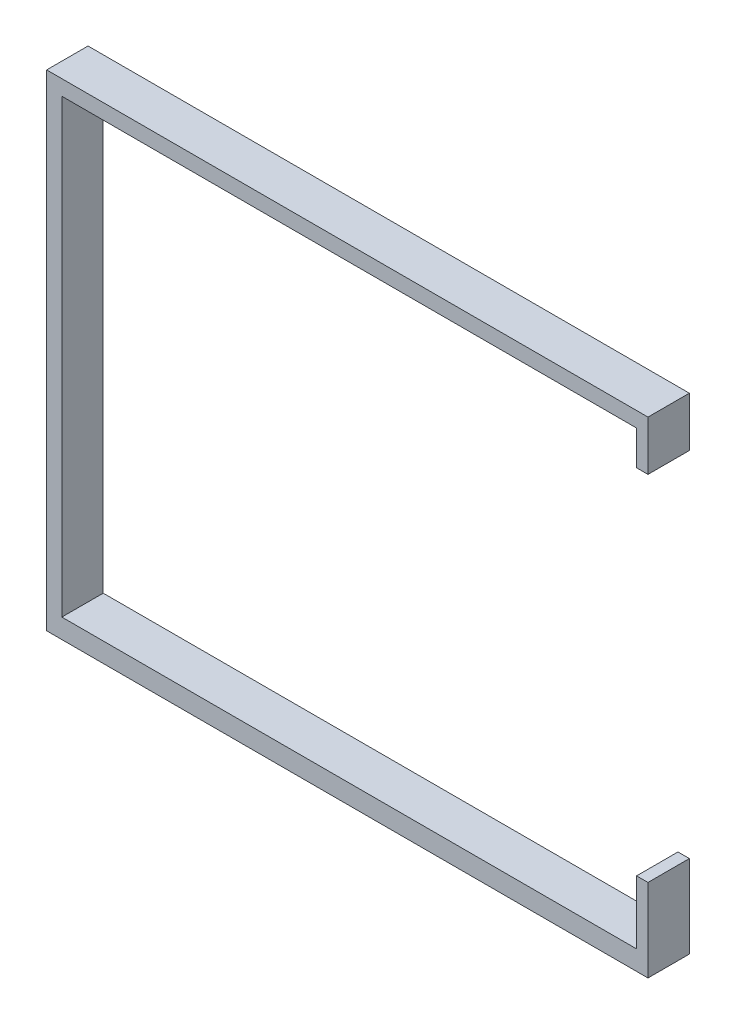
ISO-10303-21;
HEADER;
FILE_DESCRIPTION(('STEP AP214'),'2;1');
FILE_NAME('part.step','',(''),(''),'','','');
FILE_SCHEMA(('AUTOMOTIVE_DESIGN { 1 0 10303 214 1 1 1 1 }'));
ENDSEC;
DATA;
#1=APPLICATION_CONTEXT('core data for automotive mechanical design processes');
#2=APPLICATION_PROTOCOL_DEFINITION('international standard','automotive_design',2000,#1);
#3=PRODUCT_CONTEXT('',#1,'mechanical');
#4=PRODUCT('Part','Part','',(#3));
#5=PRODUCT_RELATED_PRODUCT_CATEGORY('part','',(#4));
#6=PRODUCT_DEFINITION_FORMATION('','',#4);
#7=PRODUCT_DEFINITION_CONTEXT('part definition',#1,'design');
#8=PRODUCT_DEFINITION('design','',#6,#7);
#9=PRODUCT_DEFINITION_SHAPE('','',#8);
#10=(LENGTH_UNIT() NAMED_UNIT(*) SI_UNIT(.MILLI.,.METRE.));
#11=(NAMED_UNIT(*) PLANE_ANGLE_UNIT() SI_UNIT($,.RADIAN.));
#12=(NAMED_UNIT(*) SI_UNIT($,.STERADIAN.) SOLID_ANGLE_UNIT());
#13=UNCERTAINTY_MEASURE_WITH_UNIT(LENGTH_MEASURE(1.E-05),#10,'distance_accuracy_value','');
#14=(GEOMETRIC_REPRESENTATION_CONTEXT(3) GLOBAL_UNCERTAINTY_ASSIGNED_CONTEXT((#13)) GLOBAL_UNIT_ASSIGNED_CONTEXT((#10,
#11,#12)) REPRESENTATION_CONTEXT('',''));
#15=CARTESIAN_POINT('',(0.,0.,0.));
#16=DIRECTION('',(0.,0.,1.));
#17=DIRECTION('',(1.,0.,0.));
#18=AXIS2_PLACEMENT_3D('',#15,#16,#17);
#19=CARTESIAN_POINT('',(35.7762962962963,25.9940740740741,5.));
#20=DIRECTION('',(-1.,0.,0.));
#21=DIRECTION('',(0.,0.,1.));
#22=AXIS2_PLACEMENT_3D('',#19,#20,#21);
#23=PLANE('',#22);
#24=DIRECTION('',(0.,1.,0.));
#25=VECTOR('',#24,1.);
#26=CARTESIAN_POINT('',(35.7762962962963,25.9940740740741,5.));
#27=LINE('',#26,#25);
#28=CARTESIAN_POINT('',(35.7762962962963,19.9940740740741,5.));
#29=VERTEX_POINT('',#28);
#30=CARTESIAN_POINT('',(35.7762962962963,25.9940740740741,5.));
#31=VERTEX_POINT('',#30);
#32=EDGE_CURVE('E236',#29,#31,#27,.T.);
#33=ORIENTED_EDGE('',*,*,#32,.F.);
#34=DIRECTION('',(0.,0.,1.));
#35=VECTOR('',#34,1.);
#36=CARTESIAN_POINT('',(35.7762962962963,19.9940740740741,5.));
#37=LINE('',#36,#35);
#38=CARTESIAN_POINT('',(35.7762962962963,19.9940740740741,0.));
#39=VERTEX_POINT('',#38);
#40=EDGE_CURVE('E196',#39,#29,#37,.T.);
#41=ORIENTED_EDGE('',*,*,#40,.F.);
#42=DIRECTION('',(0.,1.,0.));
#43=VECTOR('',#42,1.);
#44=CARTESIAN_POINT('',(35.7762962962963,25.9940740740741,0.));
#45=LINE('',#44,#43);
#46=CARTESIAN_POINT('',(35.7762962962963,25.9940740740741,0.));
#47=VERTEX_POINT('',#46);
#48=EDGE_CURVE('E158',#39,#47,#45,.T.);
#49=ORIENTED_EDGE('',*,*,#48,.T.);
#50=DIRECTION('',(0.,0.,-1.));
#51=VECTOR('',#50,1.);
#52=CARTESIAN_POINT('',(35.7762962962963,25.9940740740741,5.));
#53=LINE('',#52,#51);
#54=EDGE_CURVE('E172',#31,#47,#53,.T.);
#55=ORIENTED_EDGE('',*,*,#54,.F.);
#56=EDGE_LOOP('',(#33,#41,#49,#55));
#57=FACE_BOUND('',#56,.T.);
#58=ADVANCED_FACE('F45',(#57),#23,.F.);
#59=CARTESIAN_POINT('',(34.3985185185185,24.157037037037,5.));
#60=DIRECTION('',(-1.,0.,0.));
#61=DIRECTION('',(0.,-1.,0.));
#62=AXIS2_PLACEMENT_3D('',#59,#60,#61);
#63=PLANE('',#62);
#64=DIRECTION('',(0.,0.,-1.));
#65=VECTOR('',#64,1.);
#66=CARTESIAN_POINT('',(34.3985185185185,19.9940740740741,5.));
#67=LINE('',#66,#65);
#68=CARTESIAN_POINT('',(34.3985185185185,19.9940740740741,5.));
#69=VERTEX_POINT('',#68);
#70=CARTESIAN_POINT('',(34.3985185185185,19.9940740740741,0.));
#71=VERTEX_POINT('',#70);
#72=EDGE_CURVE('E54',#69,#71,#67,.T.);
#73=ORIENTED_EDGE('',*,*,#72,.F.);
#74=DIRECTION('',(0.,1.,0.));
#75=VECTOR('',#74,1.);
#76=CARTESIAN_POINT('',(34.3985185185185,24.157037037037,5.));
#77=LINE('',#76,#75);
#78=CARTESIAN_POINT('',(34.3985185185185,24.157037037037,5.));
#79=VERTEX_POINT('',#78);
#80=EDGE_CURVE('E272',#69,#79,#77,.T.);
#81=ORIENTED_EDGE('',*,*,#80,.T.);
#82=DIRECTION('',(0.,0.,-1.));
#83=VECTOR('',#82,1.);
#84=CARTESIAN_POINT('',(34.3985185185185,24.157037037037,5.));
#85=LINE('',#84,#83);
#86=CARTESIAN_POINT('',(34.3985185185185,24.157037037037,0.));
#87=VERTEX_POINT('',#86);
#88=EDGE_CURVE('E200',#79,#87,#85,.T.);
#89=ORIENTED_EDGE('',*,*,#88,.T.);
#90=DIRECTION('',(0.,1.,0.));
#91=VECTOR('',#90,1.);
#92=CARTESIAN_POINT('',(34.3985185185185,24.157037037037,0.));
#93=LINE('',#92,#91);
#94=EDGE_CURVE('E192',#71,#87,#93,.T.);
#95=ORIENTED_EDGE('',*,*,#94,.F.);
#96=EDGE_LOOP('',(#73,#81,#89,#95));
#97=FACE_BOUND('',#96,.T.);
#98=ADVANCED_FACE('F198',(#97),#63,.T.);
#99=CARTESIAN_POINT('',(0.,0.,5.));
#100=DIRECTION('',(0.,0.,1.));
#101=DIRECTION('',(1.,0.,0.));
#102=AXIS2_PLACEMENT_3D('',#99,#100,#101);
#103=PLANE('',#102);
#104=DIRECTION('',(1.,0.,0.));
#105=VECTOR('',#104,1.);
#106=CARTESIAN_POINT('',(25.7762962962963,-22.6992592592593,5.));
#107=LINE('',#106,#105);
#108=CARTESIAN_POINT('',(34.3985185185185,-22.6992592592593,5.));
#109=VERTEX_POINT('',#108);
#110=CARTESIAN_POINT('',(35.7762962962963,-22.6992592592593,5.));
#111=VERTEX_POINT('',#110);
#112=EDGE_CURVE('E135',#109,#111,#107,.T.);
#113=ORIENTED_EDGE('',*,*,#112,.F.);
#114=CARTESIAN_POINT('',(34.3985185185185,-30.342962962963,5.));
#115=VERTEX_POINT('',#114);
#116=EDGE_CURVE('E273',#115,#109,#77,.T.);
#117=ORIENTED_EDGE('',*,*,#116,.F.);
#118=DIRECTION('',(1.,0.,0.));
#119=VECTOR('',#118,1.);
#120=CARTESIAN_POINT('',(-35.0414814814815,-30.342962962963,5.));
#121=LINE('',#120,#119);
#122=CARTESIAN_POINT('',(-35.0414814814815,-30.342962962963,5.));
#123=VERTEX_POINT('',#122);
#124=EDGE_CURVE('E269',#123,#115,#121,.T.);
#125=ORIENTED_EDGE('',*,*,#124,.F.);
#126=DIRECTION('',(0.,-1.,0.));
#127=VECTOR('',#126,1.);
#128=CARTESIAN_POINT('',(-35.0414814814815,24.157037037037,5.));
#129=LINE('',#128,#127);
#130=CARTESIAN_POINT('',(-35.0414814814815,24.157037037037,5.));
#131=VERTEX_POINT('',#130);
#132=EDGE_CURVE('E214',#131,#123,#129,.T.);
#133=ORIENTED_EDGE('',*,*,#132,.F.);
#134=DIRECTION('',(-1.,0.,0.));
#135=VECTOR('',#134,1.);
#136=CARTESIAN_POINT('',(-35.0414814814815,24.157037037037,5.));
#137=LINE('',#136,#135);
#138=EDGE_CURVE('E219',#79,#131,#137,.T.);
#139=ORIENTED_EDGE('',*,*,#138,.F.);
#140=ORIENTED_EDGE('',*,*,#80,.F.);
#141=DIRECTION('',(1.,0.,0.));
#142=VECTOR('',#141,1.);
#143=CARTESIAN_POINT('',(25.7762962962963,19.9940740740741,5.));
#144=LINE('',#143,#142);
#145=EDGE_CURVE('E68',#69,#29,#144,.T.);
#146=ORIENTED_EDGE('',*,*,#145,.T.);
#147=ORIENTED_EDGE('',*,*,#32,.T.);
#148=DIRECTION('',(-1.,0.,0.));
#149=VECTOR('',#148,1.);
#150=CARTESIAN_POINT('',(-36.8785185185185,25.9940740740741,5.));
#151=LINE('',#150,#149);
#152=CARTESIAN_POINT('',(-36.8785185185185,25.9940740740741,5.));
#153=VERTEX_POINT('',#152);
#154=EDGE_CURVE('E173',#31,#153,#151,.T.);
#155=ORIENTED_EDGE('',*,*,#154,.T.);
#156=DIRECTION('',(0.,-1.,0.));
#157=VECTOR('',#156,1.);
#158=CARTESIAN_POINT('',(-36.8785185185185,25.9940740740741,5.));
#159=LINE('',#158,#157);
#160=CARTESIAN_POINT('',(-36.8785185185185,-32.6992592592593,5.));
#161=VERTEX_POINT('',#160);
#162=EDGE_CURVE('E162',#153,#161,#159,.T.);
#163=ORIENTED_EDGE('',*,*,#162,.T.);
#164=DIRECTION('',(1.,0.,0.));
#165=VECTOR('',#164,1.);
#166=CARTESIAN_POINT('',(-36.8785185185185,-32.6992592592593,5.));
#167=LINE('',#166,#165);
#168=CARTESIAN_POINT('',(35.7762962962963,-32.6992592592593,5.));
#169=VERTEX_POINT('',#168);
#170=EDGE_CURVE('E233',#161,#169,#167,.T.);
#171=ORIENTED_EDGE('',*,*,#170,.T.);
#172=EDGE_CURVE('E237',#169,#111,#27,.T.);
#173=ORIENTED_EDGE('',*,*,#172,.T.);
#174=EDGE_LOOP('',(#113,#117,#125,#133,#139,#140,#146,#147,#155,#163,#171,#173));
#175=FACE_BOUND('',#174,.T.);
#176=ADVANCED_FACE('F256',(#175),#103,.T.);
#177=CARTESIAN_POINT('',(0.,0.,0.));
#178=DIRECTION('',(0.,0.,1.));
#179=DIRECTION('',(1.,0.,0.));
#180=AXIS2_PLACEMENT_3D('',#177,#178,#179);
#181=PLANE('',#180);
#182=CARTESIAN_POINT('',(34.3985185185185,-30.342962962963,0.));
#183=VERTEX_POINT('',#182);
#184=CARTESIAN_POINT('',(34.3985185185185,-22.6992592592593,0.));
#185=VERTEX_POINT('',#184);
#186=EDGE_CURVE('E149',#183,#185,#93,.T.);
#187=ORIENTED_EDGE('',*,*,#186,.T.);
#188=DIRECTION('',(1.,0.,0.));
#189=VECTOR('',#188,1.);
#190=CARTESIAN_POINT('',(25.7762962962963,-22.6992592592593,0.));
#191=LINE('',#190,#189);
#192=CARTESIAN_POINT('',(35.7762962962963,-22.6992592592593,0.));
#193=VERTEX_POINT('',#192);
#194=EDGE_CURVE('E60',#185,#193,#191,.T.);
#195=ORIENTED_EDGE('',*,*,#194,.T.);
#196=CARTESIAN_POINT('',(35.7762962962963,-32.6992592592593,0.));
#197=VERTEX_POINT('',#196);
#198=EDGE_CURVE('E146',#197,#193,#45,.T.);
#199=ORIENTED_EDGE('',*,*,#198,.F.);
#200=DIRECTION('',(1.,0.,0.));
#201=VECTOR('',#200,1.);
#202=CARTESIAN_POINT('',(-36.8785185185185,-32.6992592592593,0.));
#203=LINE('',#202,#201);
#204=CARTESIAN_POINT('',(-36.8785185185185,-32.6992592592593,0.));
#205=VERTEX_POINT('',#204);
#206=EDGE_CURVE('E164',#205,#197,#203,.T.);
#207=ORIENTED_EDGE('',*,*,#206,.F.);
#208=DIRECTION('',(0.,-1.,0.));
#209=VECTOR('',#208,1.);
#210=CARTESIAN_POINT('',(-36.8785185185185,25.9940740740741,0.));
#211=LINE('',#210,#209);
#212=CARTESIAN_POINT('',(-36.8785185185185,25.9940740740741,0.));
#213=VERTEX_POINT('',#212);
#214=EDGE_CURVE('E229',#213,#205,#211,.T.);
#215=ORIENTED_EDGE('',*,*,#214,.F.);
#216=DIRECTION('',(-1.,0.,0.));
#217=VECTOR('',#216,1.);
#218=CARTESIAN_POINT('',(-36.8785185185185,25.9940740740741,0.));
#219=LINE('',#218,#217);
#220=EDGE_CURVE('E157',#47,#213,#219,.T.);
#221=ORIENTED_EDGE('',*,*,#220,.F.);
#222=ORIENTED_EDGE('',*,*,#48,.F.);
#223=DIRECTION('',(1.,0.,0.));
#224=VECTOR('',#223,1.);
#225=CARTESIAN_POINT('',(25.7762962962963,19.9940740740741,0.));
#226=LINE('',#225,#224);
#227=EDGE_CURVE('E185',#71,#39,#226,.T.);
#228=ORIENTED_EDGE('',*,*,#227,.F.);
#229=ORIENTED_EDGE('',*,*,#94,.T.);
#230=DIRECTION('',(-1.,0.,0.));
#231=VECTOR('',#230,1.);
#232=CARTESIAN_POINT('',(-35.0414814814815,24.157037037037,0.));
#233=LINE('',#232,#231);
#234=CARTESIAN_POINT('',(-35.0414814814815,24.157037037037,0.));
#235=VERTEX_POINT('',#234);
#236=EDGE_CURVE('E207',#87,#235,#233,.T.);
#237=ORIENTED_EDGE('',*,*,#236,.T.);
#238=DIRECTION('',(0.,-1.,0.));
#239=VECTOR('',#238,1.);
#240=CARTESIAN_POINT('',(-35.0414814814815,24.157037037037,0.));
#241=LINE('',#240,#239);
#242=CARTESIAN_POINT('',(-35.0414814814815,-30.342962962963,0.));
#243=VERTEX_POINT('',#242);
#244=EDGE_CURVE('E208',#235,#243,#241,.T.);
#245=ORIENTED_EDGE('',*,*,#244,.T.);
#246=DIRECTION('',(1.,0.,0.));
#247=VECTOR('',#246,1.);
#248=CARTESIAN_POINT('',(-35.0414814814815,-30.342962962963,0.));
#249=LINE('',#248,#247);
#250=EDGE_CURVE('E203',#243,#183,#249,.T.);
#251=ORIENTED_EDGE('',*,*,#250,.T.);
#252=EDGE_LOOP('',(#187,#195,#199,#207,#215,#221,#222,#228,#229,#237,#245,#251));
#253=FACE_BOUND('',#252,.T.);
#254=ADVANCED_FACE('F145',(#253),#181,.F.);
#255=CARTESIAN_POINT('',(-36.8785185185185,25.9940740740741,5.));
#256=DIRECTION('',(1.,0.,0.));
#257=DIRECTION('',(0.,0.,-1.));
#258=AXIS2_PLACEMENT_3D('',#255,#256,#257);
#259=PLANE('',#258);
#260=ORIENTED_EDGE('',*,*,#214,.T.);
#261=DIRECTION('',(0.,0.,-1.));
#262=VECTOR('',#261,1.);
#263=CARTESIAN_POINT('',(-36.8785185185185,-32.6992592592593,5.));
#264=LINE('',#263,#262);
#265=EDGE_CURVE('E179',#161,#205,#264,.T.);
#266=ORIENTED_EDGE('',*,*,#265,.F.);
#267=ORIENTED_EDGE('',*,*,#162,.F.);
#268=DIRECTION('',(0.,0.,-1.));
#269=VECTOR('',#268,1.);
#270=CARTESIAN_POINT('',(-36.8785185185185,25.9940740740741,5.));
#271=LINE('',#270,#269);
#272=EDGE_CURVE('E168',#153,#213,#271,.T.);
#273=ORIENTED_EDGE('',*,*,#272,.T.);
#274=EDGE_LOOP('',(#260,#266,#267,#273));
#275=FACE_BOUND('',#274,.T.);
#276=ADVANCED_FACE('F47',(#275),#259,.F.);
#277=CARTESIAN_POINT('',(-36.8785185185185,-32.6992592592593,5.));
#278=DIRECTION('',(0.,1.,0.));
#279=DIRECTION('',(0.,0.,1.));
#280=AXIS2_PLACEMENT_3D('',#277,#278,#279);
#281=PLANE('',#280);
#282=ORIENTED_EDGE('',*,*,#206,.T.);
#283=DIRECTION('',(0.,0.,-1.));
#284=VECTOR('',#283,1.);
#285=CARTESIAN_POINT('',(35.7762962962963,-32.6992592592593,5.));
#286=LINE('',#285,#284);
#287=EDGE_CURVE('E155',#169,#197,#286,.T.);
#288=ORIENTED_EDGE('',*,*,#287,.F.);
#289=ORIENTED_EDGE('',*,*,#170,.F.);
#290=ORIENTED_EDGE('',*,*,#265,.T.);
#291=EDGE_LOOP('',(#282,#288,#289,#290));
#292=FACE_BOUND('',#291,.T.);
#293=ADVANCED_FACE('F248',(#292),#281,.F.);
#294=ORIENTED_EDGE('',*,*,#198,.T.);
#295=DIRECTION('',(0.,0.,-1.));
#296=VECTOR('',#295,1.);
#297=CARTESIAN_POINT('',(35.7762962962963,-22.6992592592593,5.));
#298=LINE('',#297,#296);
#299=EDGE_CURVE('E132',#111,#193,#298,.T.);
#300=ORIENTED_EDGE('',*,*,#299,.F.);
#301=ORIENTED_EDGE('',*,*,#172,.F.);
#302=ORIENTED_EDGE('',*,*,#287,.T.);
#303=EDGE_LOOP('',(#294,#300,#301,#302));
#304=FACE_BOUND('',#303,.T.);
#305=ADVANCED_FACE('F153',(#304),#23,.F.);
#306=CARTESIAN_POINT('',(-36.8785185185185,25.9940740740741,5.));
#307=DIRECTION('',(0.,-1.,0.));
#308=DIRECTION('',(0.,0.,-1.));
#309=AXIS2_PLACEMENT_3D('',#306,#307,#308);
#310=PLANE('',#309);
#311=ORIENTED_EDGE('',*,*,#220,.T.);
#312=ORIENTED_EDGE('',*,*,#272,.F.);
#313=ORIENTED_EDGE('',*,*,#154,.F.);
#314=ORIENTED_EDGE('',*,*,#54,.T.);
#315=EDGE_LOOP('',(#311,#312,#313,#314));
#316=FACE_BOUND('',#315,.T.);
#317=ADVANCED_FACE('F251',(#316),#310,.F.);
#318=CARTESIAN_POINT('',(-35.0414814814815,24.157037037037,5.));
#319=DIRECTION('',(1.,0.,0.));
#320=DIRECTION('',(0.,1.,0.));
#321=AXIS2_PLACEMENT_3D('',#318,#319,#320);
#322=PLANE('',#321);
#323=ORIENTED_EDGE('',*,*,#244,.F.);
#324=DIRECTION('',(0.,0.,-1.));
#325=VECTOR('',#324,1.);
#326=CARTESIAN_POINT('',(-35.0414814814815,24.157037037037,5.));
#327=LINE('',#326,#325);
#328=EDGE_CURVE('E215',#131,#235,#327,.T.);
#329=ORIENTED_EDGE('',*,*,#328,.F.);
#330=ORIENTED_EDGE('',*,*,#132,.T.);
#331=DIRECTION('',(0.,0.,-1.));
#332=VECTOR('',#331,1.);
#333=CARTESIAN_POINT('',(-35.0414814814815,-30.342962962963,5.));
#334=LINE('',#333,#332);
#335=EDGE_CURVE('E225',#123,#243,#334,.T.);
#336=ORIENTED_EDGE('',*,*,#335,.T.);
#337=EDGE_LOOP('',(#323,#329,#330,#336));
#338=FACE_BOUND('',#337,.T.);
#339=ADVANCED_FACE('F282',(#338),#322,.T.);
#340=CARTESIAN_POINT('',(-35.0414814814815,-30.342962962963,5.));
#341=DIRECTION('',(0.,1.,0.));
#342=DIRECTION('',(0.,0.,1.));
#343=AXIS2_PLACEMENT_3D('',#340,#341,#342);
#344=PLANE('',#343);
#345=ORIENTED_EDGE('',*,*,#250,.F.);
#346=ORIENTED_EDGE('',*,*,#335,.F.);
#347=ORIENTED_EDGE('',*,*,#124,.T.);
#348=DIRECTION('',(0.,0.,-1.));
#349=VECTOR('',#348,1.);
#350=CARTESIAN_POINT('',(34.3985185185185,-30.342962962963,5.));
#351=LINE('',#350,#349);
#352=EDGE_CURVE('E222',#115,#183,#351,.T.);
#353=ORIENTED_EDGE('',*,*,#352,.T.);
#354=EDGE_LOOP('',(#345,#346,#347,#353));
#355=FACE_BOUND('',#354,.T.);
#356=ADVANCED_FACE('F291',(#355),#344,.T.);
#357=DIRECTION('',(0.,0.,1.));
#358=VECTOR('',#357,1.);
#359=CARTESIAN_POINT('',(34.3985185185185,-22.6992592592593,5.));
#360=LINE('',#359,#358);
#361=EDGE_CURVE('E11',#185,#109,#360,.T.);
#362=ORIENTED_EDGE('',*,*,#361,.F.);
#363=ORIENTED_EDGE('',*,*,#186,.F.);
#364=ORIENTED_EDGE('',*,*,#352,.F.);
#365=ORIENTED_EDGE('',*,*,#116,.T.);
#366=EDGE_LOOP('',(#362,#363,#364,#365));
#367=FACE_BOUND('',#366,.T.);
#368=ADVANCED_FACE('F294',(#367),#63,.T.);
#369=CARTESIAN_POINT('',(-35.0414814814815,24.157037037037,5.));
#370=DIRECTION('',(0.,-1.,0.));
#371=DIRECTION('',(0.,0.,-1.));
#372=AXIS2_PLACEMENT_3D('',#369,#370,#371);
#373=PLANE('',#372);
#374=ORIENTED_EDGE('',*,*,#236,.F.);
#375=ORIENTED_EDGE('',*,*,#88,.F.);
#376=ORIENTED_EDGE('',*,*,#138,.T.);
#377=ORIENTED_EDGE('',*,*,#328,.T.);
#378=EDGE_LOOP('',(#374,#375,#376,#377));
#379=FACE_BOUND('',#378,.T.);
#380=ADVANCED_FACE('F286',(#379),#373,.T.);
#381=CARTESIAN_POINT('',(25.7762962962963,19.9940740740741,5.));
#382=DIRECTION('',(0.,1.,0.));
#383=DIRECTION('',(0.,0.,1.));
#384=AXIS2_PLACEMENT_3D('',#381,#382,#383);
#385=PLANE('',#384);
#386=ORIENTED_EDGE('',*,*,#72,.T.);
#387=ORIENTED_EDGE('',*,*,#227,.T.);
#388=ORIENTED_EDGE('',*,*,#40,.T.);
#389=ORIENTED_EDGE('',*,*,#145,.F.);
#390=EDGE_LOOP('',(#386,#387,#388,#389));
#391=FACE_BOUND('',#390,.T.);
#392=ADVANCED_FACE('F184',(#391),#385,.F.);
#393=CARTESIAN_POINT('',(25.7762962962963,-22.6992592592593,5.));
#394=DIRECTION('',(0.,-1.,0.));
#395=DIRECTION('',(0.,0.,-1.));
#396=AXIS2_PLACEMENT_3D('',#393,#394,#395);
#397=PLANE('',#396);
#398=ORIENTED_EDGE('',*,*,#361,.T.);
#399=ORIENTED_EDGE('',*,*,#112,.T.);
#400=ORIENTED_EDGE('',*,*,#299,.T.);
#401=ORIENTED_EDGE('',*,*,#194,.F.);
#402=EDGE_LOOP('',(#398,#399,#400,#401));
#403=FACE_BOUND('',#402,.T.);
#404=ADVANCED_FACE('F133',(#403),#397,.F.);
#405=CLOSED_SHELL('',(#58,#98,#176,#254,#276,#293,#305,#317,#339,#356,#368,#380,#392,#404));
#406=MANIFOLD_SOLID_BREP('B2',#405);
#407=ADVANCED_BREP_SHAPE_REPRESENTATION('',(#18,#406),#14);
#408=SHAPE_DEFINITION_REPRESENTATION(#9,#407);
ENDSEC;
END-ISO-10303-21;
